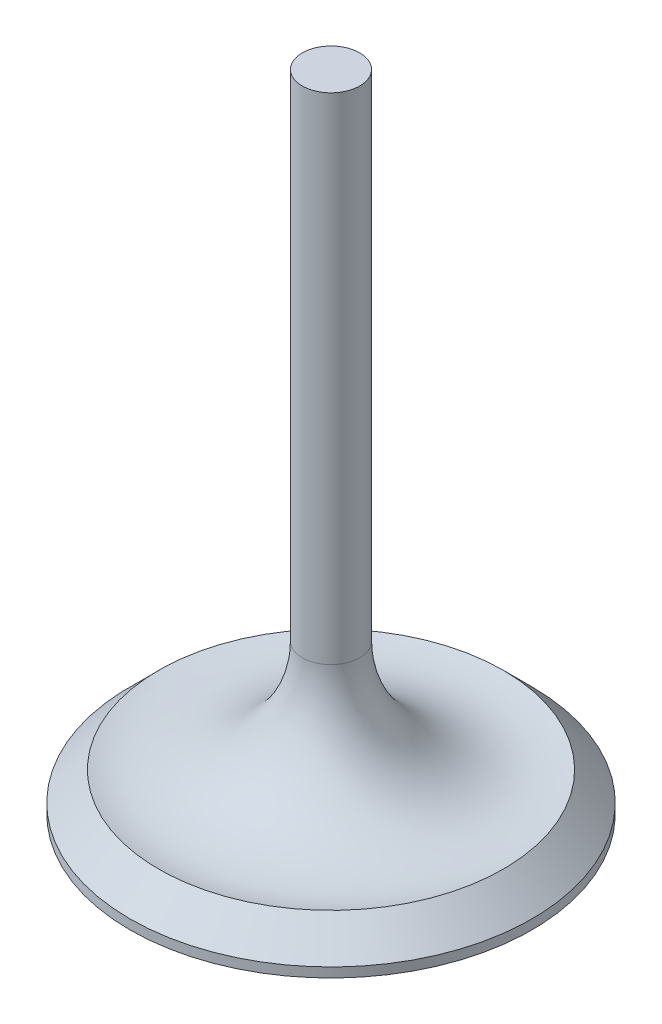
ISO-10303-21;
HEADER;
FILE_DESCRIPTION(('STEP AP214'),'2;1');
FILE_NAME('part.step','',(''),(''),'','','');
FILE_SCHEMA(('AUTOMOTIVE_DESIGN { 1 0 10303 214 1 1 1 1 }'));
ENDSEC;
DATA;
#1=APPLICATION_CONTEXT('core data for automotive mechanical design processes');
#2=APPLICATION_PROTOCOL_DEFINITION('international standard','automotive_design',2000,#1);
#3=PRODUCT_CONTEXT('',#1,'mechanical');
#4=PRODUCT('Part','Part','',(#3));
#5=PRODUCT_RELATED_PRODUCT_CATEGORY('part','',(#4));
#6=PRODUCT_DEFINITION_FORMATION('','',#4);
#7=PRODUCT_DEFINITION_CONTEXT('part definition',#1,'design');
#8=PRODUCT_DEFINITION('design','',#6,#7);
#9=PRODUCT_DEFINITION_SHAPE('','',#8);
#10=(LENGTH_UNIT() NAMED_UNIT(*) SI_UNIT(.MILLI.,.METRE.));
#11=(NAMED_UNIT(*) PLANE_ANGLE_UNIT() SI_UNIT($,.RADIAN.));
#12=(NAMED_UNIT(*) SI_UNIT($,.STERADIAN.) SOLID_ANGLE_UNIT());
#13=UNCERTAINTY_MEASURE_WITH_UNIT(LENGTH_MEASURE(1.E-05),#10,'distance_accuracy_value','');
#14=(GEOMETRIC_REPRESENTATION_CONTEXT(3) GLOBAL_UNCERTAINTY_ASSIGNED_CONTEXT((#13)) GLOBAL_UNIT_ASSIGNED_CONTEXT((#10,
#11,#12)) REPRESENTATION_CONTEXT('',''));
#15=CARTESIAN_POINT('',(0.,0.,0.));
#16=DIRECTION('',(0.,0.,1.));
#17=DIRECTION('',(1.,0.,0.));
#18=AXIS2_PLACEMENT_3D('',#15,#16,#17);
#19=CARTESIAN_POINT('',(26.67,0.,0.));
#20=DIRECTION('',(0.,-1.,0.));
#21=DIRECTION('',(0.,0.,-1.));
#22=AXIS2_PLACEMENT_3D('',#19,#20,#21);
#23=PLANE('',#22);
#24=CARTESIAN_POINT('',(0.,0.,0.));
#25=DIRECTION('',(0.,-1.,0.));
#26=DIRECTION('',(0.,0.,-1.));
#27=AXIS2_PLACEMENT_3D('',#24,#25,#26);
#28=CIRCLE('',#27,26.67);
#29=CARTESIAN_POINT('',(0.,0.,-26.67));
#30=VERTEX_POINT('',#29);
#31=EDGE_CURVE('E10',#30,#30,#28,.T.);
#32=ORIENTED_EDGE('',*,*,#31,.T.);
#33=EDGE_LOOP('',(#32));
#34=FACE_BOUND('',#33,.T.);
#35=ADVANCED_FACE('F39',(#34),#23,.T.);
#36=CARTESIAN_POINT('',(0.,0.,0.));
#37=DIRECTION('',(0.,-1.,0.));
#38=DIRECTION('',(0.,0.,-1.));
#39=AXIS2_PLACEMENT_3D('',#36,#37,#38);
#40=CYLINDRICAL_SURFACE('',#39,26.67);
#41=CARTESIAN_POINT('',(0.,1.27,0.));
#42=DIRECTION('',(0.,-1.,0.));
#43=DIRECTION('',(0.,0.,-1.));
#44=AXIS2_PLACEMENT_3D('',#41,#42,#43);
#45=CIRCLE('',#44,26.67);
#46=CARTESIAN_POINT('',(0.,1.27,-26.67));
#47=VERTEX_POINT('',#46);
#48=EDGE_CURVE('E45',#47,#47,#45,.T.);
#49=ORIENTED_EDGE('',*,*,#48,.T.);
#50=EDGE_LOOP('',(#49));
#51=FACE_BOUND('',#50,.T.);
#52=ORIENTED_EDGE('',*,*,#31,.F.);
#53=EDGE_LOOP('',(#52));
#54=FACE_BOUND('',#53,.T.);
#55=ADVANCED_FACE('F74',(#51,#54),#40,.T.);
#56=CARTESIAN_POINT('',(0.,1.27,0.));
#57=DIRECTION('',(0.,-1.,0.));
#58=DIRECTION('',(0.,0.,-1.));
#59=AXIS2_PLACEMENT_3D('',#56,#57,#58);
#60=CONICAL_SURFACE('',#59,26.67,0.785398163397453);
#61=CARTESIAN_POINT('',(0.,5.08,0.));
#62=DIRECTION('',(0.,-1.,0.));
#63=DIRECTION('',(0.,0.,-1.));
#64=AXIS2_PLACEMENT_3D('',#61,#62,#63);
#65=CIRCLE('',#64,22.86);
#66=CARTESIAN_POINT('',(0.,5.08,-22.86));
#67=VERTEX_POINT('',#66);
#68=EDGE_CURVE('E49',#67,#67,#65,.T.);
#69=ORIENTED_EDGE('',*,*,#68,.T.);
#70=EDGE_LOOP('',(#69));
#71=FACE_BOUND('',#70,.T.);
#72=ORIENTED_EDGE('',*,*,#48,.F.);
#73=EDGE_LOOP('',(#72));
#74=FACE_BOUND('',#73,.T.);
#75=ADVANCED_FACE('F78',(#71,#74),#60,.T.);
#76=CARTESIAN_POINT('',(0.,19.8489708510783,0.));
#77=DIRECTION('',(0.,-1.,0.));
#78=DIRECTION('',(0.,0.,-1.));
#79=AXIS2_PLACEMENT_3D('',#76,#77,#78);
#80=TOROIDAL_SURFACE('',#79,19.06,15.25);
#81=CARTESIAN_POINT('',(0.,19.8489708510783,0.));
#82=DIRECTION('',(0.,-1.,0.));
#83=DIRECTION('',(0.,0.,-1.));
#84=AXIS2_PLACEMENT_3D('',#81,#82,#83);
#85=CIRCLE('',#84,3.81000000000001);
#86=CARTESIAN_POINT('',(0.,19.8489708510783,-3.81000000000001));
#87=VERTEX_POINT('',#86);
#88=EDGE_CURVE('E53',#87,#87,#85,.T.);
#89=ORIENTED_EDGE('',*,*,#88,.T.);
#90=EDGE_LOOP('',(#89));
#91=FACE_BOUND('',#90,.T.);
#92=ORIENTED_EDGE('',*,*,#68,.F.);
#93=EDGE_LOOP('',(#92));
#94=FACE_BOUND('',#93,.T.);
#95=ADVANCED_FACE('F71',(#91,#94),#80,.F.);
#96=CARTESIAN_POINT('',(0.,0.,0.));
#97=DIRECTION('',(0.,-1.,0.));
#98=DIRECTION('',(0.,0.,-1.));
#99=AXIS2_PLACEMENT_3D('',#96,#97,#98);
#100=CYLINDRICAL_SURFACE('',#99,3.81000000000001);
#101=CARTESIAN_POINT('',(0.,85.55,0.));
#102=DIRECTION('',(0.,-1.,0.));
#103=DIRECTION('',(0.,0.,-1.));
#104=AXIS2_PLACEMENT_3D('',#101,#102,#103);
#105=CIRCLE('',#104,3.81);
#106=CARTESIAN_POINT('',(0.,85.55,-3.81));
#107=VERTEX_POINT('',#106);
#108=EDGE_CURVE('E58',#107,#107,#105,.T.);
#109=ORIENTED_EDGE('',*,*,#108,.T.);
#110=EDGE_LOOP('',(#109));
#111=FACE_BOUND('',#110,.T.);
#112=ORIENTED_EDGE('',*,*,#88,.F.);
#113=EDGE_LOOP('',(#112));
#114=FACE_BOUND('',#113,.T.);
#115=ADVANCED_FACE('F62',(#111,#114),#100,.T.);
#116=CARTESIAN_POINT('',(0.,85.55,0.));
#117=DIRECTION('',(0.,1.,0.));
#118=DIRECTION('',(0.,0.,1.));
#119=AXIS2_PLACEMENT_3D('',#116,#117,#118);
#120=PLANE('',#119);
#121=ORIENTED_EDGE('',*,*,#108,.F.);
#122=EDGE_LOOP('',(#121));
#123=FACE_BOUND('',#122,.T.);
#124=ADVANCED_FACE('F65',(#123),#120,.T.);
#125=CLOSED_SHELL('',(#35,#55,#75,#95,#115,#124));
#126=MANIFOLD_SOLID_BREP('B2',#125);
#127=ADVANCED_BREP_SHAPE_REPRESENTATION('',(#18,#126),#14);
#128=SHAPE_DEFINITION_REPRESENTATION(#9,#127);
ENDSEC;
END-ISO-10303-21;
